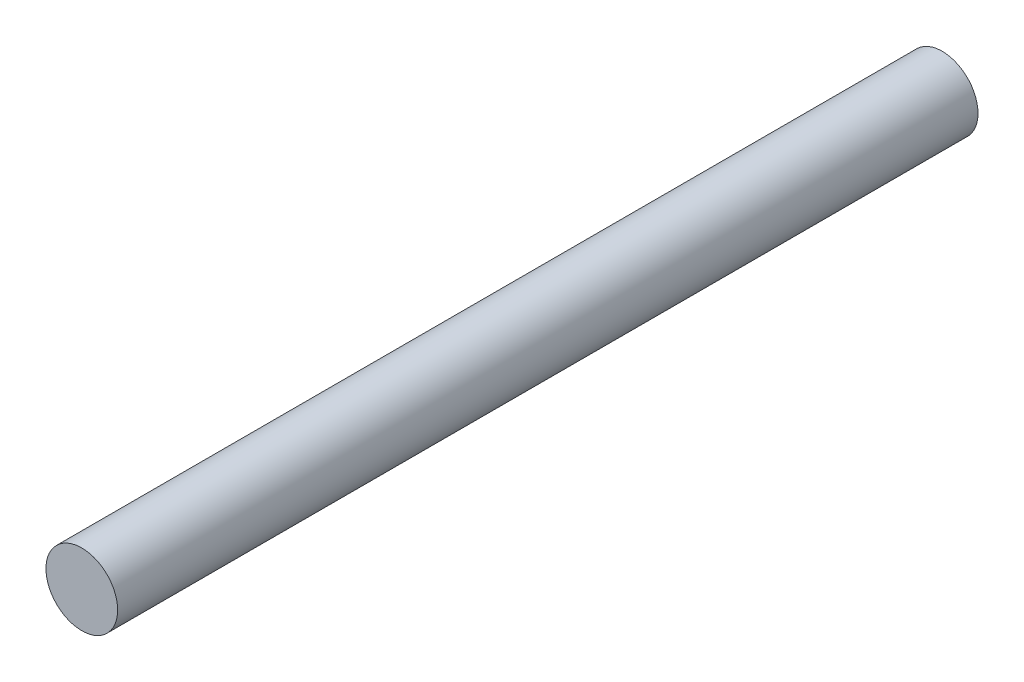
ISO-10303-21;
HEADER;
FILE_DESCRIPTION(('STEP AP214'),'2;1');
FILE_NAME('part.step','',(''),(''),'','','');
FILE_SCHEMA(('AUTOMOTIVE_DESIGN { 1 0 10303 214 1 1 1 1 }'));
ENDSEC;
DATA;
#1=APPLICATION_CONTEXT('core data for automotive mechanical design processes');
#2=APPLICATION_PROTOCOL_DEFINITION('international standard','automotive_design',2000,#1);
#3=PRODUCT_CONTEXT('',#1,'mechanical');
#4=PRODUCT('Part','Part','',(#3));
#5=PRODUCT_RELATED_PRODUCT_CATEGORY('part','',(#4));
#6=PRODUCT_DEFINITION_FORMATION('','',#4);
#7=PRODUCT_DEFINITION_CONTEXT('part definition',#1,'design');
#8=PRODUCT_DEFINITION('design','',#6,#7);
#9=PRODUCT_DEFINITION_SHAPE('','',#8);
#10=(LENGTH_UNIT() NAMED_UNIT(*) SI_UNIT(.MILLI.,.METRE.));
#11=(NAMED_UNIT(*) PLANE_ANGLE_UNIT() SI_UNIT($,.RADIAN.));
#12=(NAMED_UNIT(*) SI_UNIT($,.STERADIAN.) SOLID_ANGLE_UNIT());
#13=UNCERTAINTY_MEASURE_WITH_UNIT(LENGTH_MEASURE(1.E-05),#10,'distance_accuracy_value','');
#14=(GEOMETRIC_REPRESENTATION_CONTEXT(3) GLOBAL_UNCERTAINTY_ASSIGNED_CONTEXT((#13)) GLOBAL_UNIT_ASSIGNED_CONTEXT((#10,
#11,#12)) REPRESENTATION_CONTEXT('',''));
#15=CARTESIAN_POINT('',(0.,0.,0.));
#16=DIRECTION('',(0.,0.,1.));
#17=DIRECTION('',(1.,0.,0.));
#18=AXIS2_PLACEMENT_3D('',#15,#16,#17);
#19=CARTESIAN_POINT('',(0.,0.,30.));
#20=DIRECTION('',(0.,0.,-1.));
#21=DIRECTION('',(-1.,0.,0.));
#22=AXIS2_PLACEMENT_3D('',#19,#20,#21);
#23=CYLINDRICAL_SURFACE('',#22,1.25);
#24=CARTESIAN_POINT('',(0.,0.,30.));
#25=DIRECTION('',(0.,0.,1.));
#26=DIRECTION('',(1.,0.,0.));
#27=AXIS2_PLACEMENT_3D('',#24,#25,#26);
#28=CIRCLE('',#27,1.25);
#29=CARTESIAN_POINT('',(1.25,0.,30.));
#30=VERTEX_POINT('',#29);
#31=EDGE_CURVE('E10',#30,#30,#28,.T.);
#32=ORIENTED_EDGE('',*,*,#31,.F.);
#33=EDGE_LOOP('',(#32));
#34=FACE_BOUND('',#33,.T.);
#35=CARTESIAN_POINT('',(0.,0.,0.));
#36=DIRECTION('',(0.,0.,1.));
#37=DIRECTION('',(1.,0.,0.));
#38=AXIS2_PLACEMENT_3D('',#35,#36,#37);
#39=CIRCLE('',#38,1.25);
#40=CARTESIAN_POINT('',(1.25,0.,0.));
#41=VERTEX_POINT('',#40);
#42=EDGE_CURVE('E34',#41,#41,#39,.T.);
#43=ORIENTED_EDGE('',*,*,#42,.T.);
#44=EDGE_LOOP('',(#43));
#45=FACE_BOUND('',#44,.T.);
#46=ADVANCED_FACE('F31',(#34,#45),#23,.T.);
#47=CARTESIAN_POINT('',(0.,0.,30.));
#48=DIRECTION('',(0.,0.,1.));
#49=DIRECTION('',(1.,0.,0.));
#50=AXIS2_PLACEMENT_3D('',#47,#48,#49);
#51=PLANE('',#50);
#52=ORIENTED_EDGE('',*,*,#31,.T.);
#53=EDGE_LOOP('',(#52));
#54=FACE_BOUND('',#53,.T.);
#55=ADVANCED_FACE('F46',(#54),#51,.T.);
#56=CARTESIAN_POINT('',(0.,0.,0.));
#57=DIRECTION('',(0.,0.,1.));
#58=DIRECTION('',(1.,0.,0.));
#59=AXIS2_PLACEMENT_3D('',#56,#57,#58);
#60=PLANE('',#59);
#61=ORIENTED_EDGE('',*,*,#42,.F.);
#62=EDGE_LOOP('',(#61));
#63=FACE_BOUND('',#62,.T.);
#64=ADVANCED_FACE('F44',(#63),#60,.F.);
#65=CLOSED_SHELL('',(#46,#55,#64));
#66=MANIFOLD_SOLID_BREP('B2',#65);
#67=ADVANCED_BREP_SHAPE_REPRESENTATION('',(#18,#66),#14);
#68=SHAPE_DEFINITION_REPRESENTATION(#9,#67);
ENDSEC;
END-ISO-10303-21;
